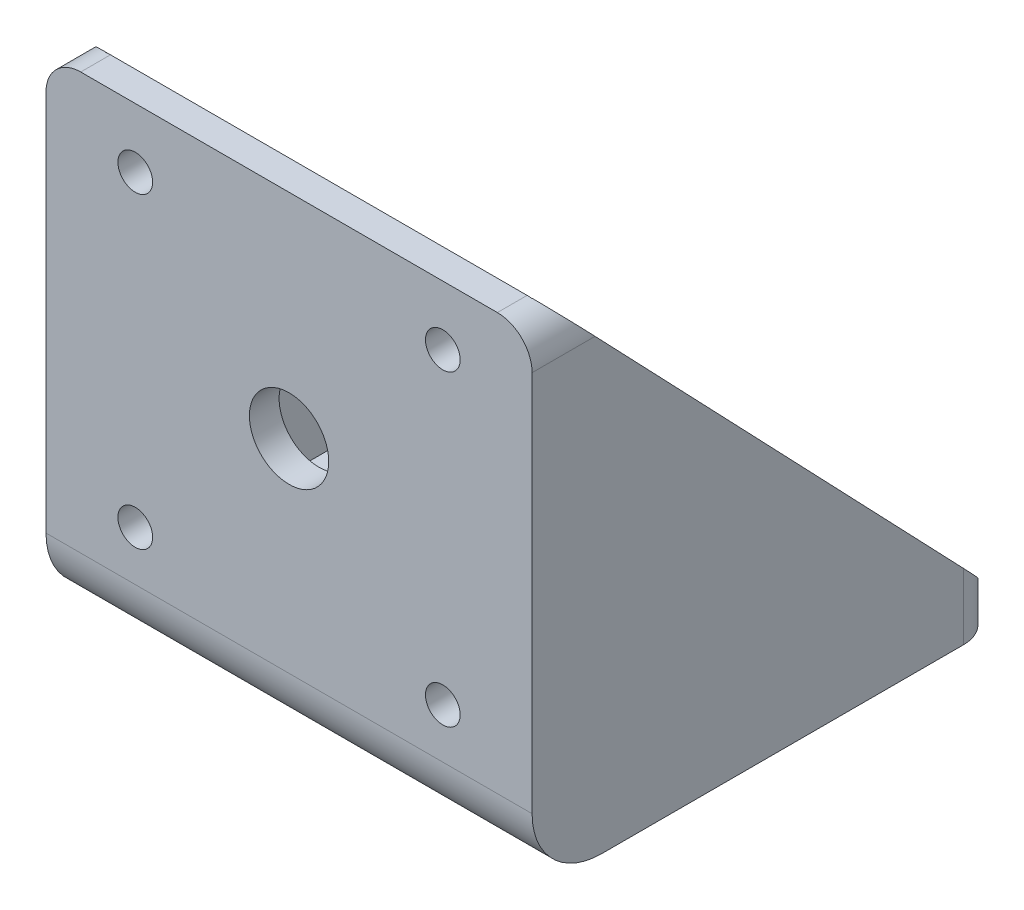
ISO-10303-21;
HEADER;
FILE_DESCRIPTION(('STEP AP214'),'2;1');
FILE_NAME('part.step','',(''),(''),'','','');
FILE_SCHEMA(('AUTOMOTIVE_DESIGN { 1 0 10303 214 1 1 1 1 }'));
ENDSEC;
DATA;
#1=APPLICATION_CONTEXT('core data for automotive mechanical design processes');
#2=APPLICATION_PROTOCOL_DEFINITION('international standard','automotive_design',2000,#1);
#3=PRODUCT_CONTEXT('',#1,'mechanical');
#4=PRODUCT('Part','Part','',(#3));
#5=PRODUCT_RELATED_PRODUCT_CATEGORY('part','',(#4));
#6=PRODUCT_DEFINITION_FORMATION('','',#4);
#7=PRODUCT_DEFINITION_CONTEXT('part definition',#1,'design');
#8=PRODUCT_DEFINITION('design','',#6,#7);
#9=PRODUCT_DEFINITION_SHAPE('','',#8);
#10=(LENGTH_UNIT() NAMED_UNIT(*) SI_UNIT(.MILLI.,.METRE.));
#11=(NAMED_UNIT(*) PLANE_ANGLE_UNIT() SI_UNIT($,.RADIAN.));
#12=(NAMED_UNIT(*) SI_UNIT($,.STERADIAN.) SOLID_ANGLE_UNIT());
#13=UNCERTAINTY_MEASURE_WITH_UNIT(LENGTH_MEASURE(1.E-05),#10,'distance_accuracy_value','');
#14=(GEOMETRIC_REPRESENTATION_CONTEXT(3) GLOBAL_UNCERTAINTY_ASSIGNED_CONTEXT((#13)) GLOBAL_UNIT_ASSIGNED_CONTEXT((#10,
#11,#12)) REPRESENTATION_CONTEXT('',''));
#15=CARTESIAN_POINT('',(0.,0.,0.));
#16=DIRECTION('',(0.,0.,1.));
#17=DIRECTION('',(1.,0.,0.));
#18=AXIS2_PLACEMENT_3D('',#15,#16,#17);
#19=CARTESIAN_POINT('',(0.,3.,0.));
#20=DIRECTION('',(0.,-1.,0.));
#21=DIRECTION('',(0.,0.,-1.));
#22=AXIS2_PLACEMENT_3D('',#19,#20,#21);
#23=PLANE('',#22);
#24=CARTESIAN_POINT('',(-14.945,3.,-12.03));
#25=DIRECTION('',(0.,1.,0.));
#26=DIRECTION('',(0.,0.,-1.));
#27=AXIS2_PLACEMENT_3D('',#24,#25,#26);
#28=CIRCLE('',#27,1.75);
#29=CARTESIAN_POINT('',(-14.945,3.,-13.78));
#30=VERTEX_POINT('',#29);
#31=EDGE_CURVE('E288',#30,#30,#28,.T.);
#32=ORIENTED_EDGE('',*,*,#31,.F.);
#33=EDGE_LOOP('',(#32));
#34=FACE_BOUND('',#33,.T.);
#35=CARTESIAN_POINT('',(-14.945,3.,12.03));
#36=DIRECTION('',(0.,1.,0.));
#37=DIRECTION('',(0.,0.,1.));
#38=AXIS2_PLACEMENT_3D('',#35,#36,#37);
#39=CIRCLE('',#38,1.75);
#40=CARTESIAN_POINT('',(-14.945,3.,13.78));
#41=VERTEX_POINT('',#40);
#42=EDGE_CURVE('E297',#41,#41,#39,.T.);
#43=ORIENTED_EDGE('',*,*,#42,.F.);
#44=EDGE_LOOP('',(#43));
#45=FACE_BOUND('',#44,.T.);
#46=CARTESIAN_POINT('',(14.945,3.,12.03));
#47=DIRECTION('',(0.,1.,0.));
#48=DIRECTION('',(0.,0.,-1.));
#49=AXIS2_PLACEMENT_3D('',#46,#47,#48);
#50=CIRCLE('',#49,1.75);
#51=CARTESIAN_POINT('',(14.945,3.,10.28));
#52=VERTEX_POINT('',#51);
#53=EDGE_CURVE('E396',#52,#52,#50,.T.);
#54=ORIENTED_EDGE('',*,*,#53,.F.);
#55=EDGE_LOOP('',(#54));
#56=FACE_BOUND('',#55,.T.);
#57=CARTESIAN_POINT('',(14.945,3.,-12.03));
#58=DIRECTION('',(0.,1.,0.));
#59=DIRECTION('',(0.,0.,1.));
#60=AXIS2_PLACEMENT_3D('',#57,#58,#59);
#61=CIRCLE('',#60,1.75);
#62=CARTESIAN_POINT('',(14.945,3.,-10.28));
#63=VERTEX_POINT('',#62);
#64=EDGE_CURVE('E304',#63,#63,#61,.T.);
#65=ORIENTED_EDGE('',*,*,#64,.F.);
#66=EDGE_LOOP('',(#65));
#67=FACE_BOUND('',#66,.T.);
#68=DIRECTION('',(0.,0.,1.));
#69=VECTOR('',#68,1.);
#70=CARTESIAN_POINT('',(-21.5,3.,23.5));
#71=LINE('',#70,#69);
#72=CARTESIAN_POINT('',(-21.5,3.,-23.4641016151377));
#73=VERTEX_POINT('',#72);
#74=CARTESIAN_POINT('',(-21.5,3.,15.5));
#75=VERTEX_POINT('',#74);
#76=EDGE_CURVE('E184',#73,#75,#71,.T.);
#77=ORIENTED_EDGE('',*,*,#76,.T.);
#78=DIRECTION('',(-1.,0.,0.));
#79=VECTOR('',#78,1.);
#80=CARTESIAN_POINT('',(21.5,3.,15.5));
#81=LINE('',#80,#79);
#82=CARTESIAN_POINT('',(21.5,3.,15.5));
#83=VERTEX_POINT('',#82);
#84=EDGE_CURVE('E51',#75,#83,#81,.F.);
#85=ORIENTED_EDGE('',*,*,#84,.T.);
#86=DIRECTION('',(0.,0.,-1.));
#87=VECTOR('',#86,1.);
#88=CARTESIAN_POINT('',(21.5,3.,23.5));
#89=LINE('',#88,#87);
#90=CARTESIAN_POINT('',(21.5,3.,-23.4641016151377));
#91=VERTEX_POINT('',#90);
#92=EDGE_CURVE('E271',#83,#91,#89,.T.);
#93=ORIENTED_EDGE('',*,*,#92,.T.);
#94=CARTESIAN_POINT('',(21.,3.,-20.));
#95=DIRECTION('',(0.,-1.,0.));
#96=DIRECTION('',(0.,0.,-1.));
#97=AXIS2_PLACEMENT_3D('',#94,#95,#96);
#98=CIRCLE('',#97,3.5);
#99=CARTESIAN_POINT('',(21.,3.,-23.5));
#100=VERTEX_POINT('',#99);
#101=EDGE_CURVE('E231',#91,#100,#98,.F.);
#102=ORIENTED_EDGE('',*,*,#101,.T.);
#103=DIRECTION('',(-1.,0.,0.));
#104=VECTOR('',#103,1.);
#105=CARTESIAN_POINT('',(-21.5,3.,-23.5));
#106=LINE('',#105,#104);
#107=CARTESIAN_POINT('',(-21.,3.,-23.5));
#108=VERTEX_POINT('',#107);
#109=EDGE_CURVE('E188',#100,#108,#106,.T.);
#110=ORIENTED_EDGE('',*,*,#109,.T.);
#111=CARTESIAN_POINT('',(-21.,3.,-20.));
#112=DIRECTION('',(0.,-1.,0.));
#113=DIRECTION('',(0.,0.,-1.));
#114=AXIS2_PLACEMENT_3D('',#111,#112,#113);
#115=CIRCLE('',#114,3.5);
#116=EDGE_CURVE('E233',#108,#73,#115,.F.);
#117=ORIENTED_EDGE('',*,*,#116,.T.);
#118=EDGE_LOOP('',(#77,#85,#93,#102,#110,#117));
#119=FACE_BOUND('',#118,.T.);
#120=ADVANCED_FACE('F43',(#34,#45,#56,#67,#119),#23,.F.);
#121=CARTESIAN_POINT('',(-21.5,3.,-23.5));
#122=DIRECTION('',(0.,0.,1.));
#123=DIRECTION('',(1.,0.,0.));
#124=AXIS2_PLACEMENT_3D('',#121,#122,#123);
#125=PLANE('',#124);
#126=DIRECTION('',(-1.,0.,0.));
#127=VECTOR('',#126,1.);
#128=CARTESIAN_POINT('',(-21.5,0.,-23.5));
#129=LINE('',#128,#127);
#130=CARTESIAN_POINT('',(21.,0.,-23.5));
#131=VERTEX_POINT('',#130);
#132=CARTESIAN_POINT('',(-21.,0.,-23.5));
#133=VERTEX_POINT('',#132);
#134=EDGE_CURVE('E265',#131,#133,#129,.T.);
#135=ORIENTED_EDGE('',*,*,#134,.T.);
#136=DIRECTION('',(0.,-1.,0.));
#137=VECTOR('',#136,1.);
#138=CARTESIAN_POINT('',(-21.,3.,-23.5));
#139=LINE('',#138,#137);
#140=EDGE_CURVE('E229',#133,#108,#139,.F.);
#141=ORIENTED_EDGE('',*,*,#140,.T.);
#142=ORIENTED_EDGE('',*,*,#109,.F.);
#143=DIRECTION('',(0.,1.,0.));
#144=VECTOR('',#143,1.);
#145=CARTESIAN_POINT('',(21.,3.,-23.5));
#146=LINE('',#145,#144);
#147=EDGE_CURVE('E227',#100,#131,#146,.F.);
#148=ORIENTED_EDGE('',*,*,#147,.T.);
#149=EDGE_LOOP('',(#135,#141,#142,#148));
#150=FACE_BOUND('',#149,.T.);
#151=ADVANCED_FACE('F328',(#150),#125,.F.);
#152=CARTESIAN_POINT('',(-21.5,3.,23.5));
#153=DIRECTION('',(0.,0.,-1.));
#154=DIRECTION('',(-1.,0.,0.));
#155=AXIS2_PLACEMENT_3D('',#152,#153,#154);
#156=PLANE('',#155);
#157=CARTESIAN_POINT('',(0.,27.5,23.5));
#158=DIRECTION('',(0.,0.,1.));
#159=DIRECTION('',(1.,0.,0.));
#160=AXIS2_PLACEMENT_3D('',#157,#158,#159);
#161=CIRCLE('',#160,4.);
#162=CARTESIAN_POINT('',(4.,27.5,23.5));
#163=VERTEX_POINT('',#162);
#164=EDGE_CURVE('E472',#163,#163,#161,.T.);
#165=ORIENTED_EDGE('',*,*,#164,.F.);
#166=EDGE_LOOP('',(#165));
#167=FACE_BOUND('',#166,.T.);
#168=CARTESIAN_POINT('',(15.5,43.,23.5));
#169=DIRECTION('',(0.,0.,1.));
#170=DIRECTION('',(-1.,0.,0.));
#171=AXIS2_PLACEMENT_3D('',#168,#169,#170);
#172=CIRCLE('',#171,1.75);
#173=CARTESIAN_POINT('',(13.75,43.,23.5));
#174=VERTEX_POINT('',#173);
#175=EDGE_CURVE('E382',#174,#174,#172,.T.);
#176=ORIENTED_EDGE('',*,*,#175,.F.);
#177=EDGE_LOOP('',(#176));
#178=FACE_BOUND('',#177,.T.);
#179=CARTESIAN_POINT('',(15.5,12.,23.5));
#180=DIRECTION('',(0.,0.,1.));
#181=DIRECTION('',(-1.,0.,0.));
#182=AXIS2_PLACEMENT_3D('',#179,#180,#181);
#183=CIRCLE('',#182,1.75);
#184=CARTESIAN_POINT('',(13.75,12.,23.5));
#185=VERTEX_POINT('',#184);
#186=EDGE_CURVE('E387',#185,#185,#183,.T.);
#187=ORIENTED_EDGE('',*,*,#186,.F.);
#188=EDGE_LOOP('',(#187));
#189=FACE_BOUND('',#188,.T.);
#190=CARTESIAN_POINT('',(-15.5,12.,23.5));
#191=DIRECTION('',(0.,0.,1.));
#192=DIRECTION('',(1.,0.,0.));
#193=AXIS2_PLACEMENT_3D('',#190,#191,#192);
#194=CIRCLE('',#193,1.75);
#195=CARTESIAN_POINT('',(-13.75,12.,23.5));
#196=VERTEX_POINT('',#195);
#197=EDGE_CURVE('E384',#196,#196,#194,.T.);
#198=ORIENTED_EDGE('',*,*,#197,.F.);
#199=EDGE_LOOP('',(#198));
#200=FACE_BOUND('',#199,.T.);
#201=CARTESIAN_POINT('',(-15.5,43.,23.5));
#202=DIRECTION('',(0.,0.,1.));
#203=DIRECTION('',(1.,0.,0.));
#204=AXIS2_PLACEMENT_3D('',#201,#202,#203);
#205=CIRCLE('',#204,1.75);
#206=CARTESIAN_POINT('',(-13.75,43.,23.5));
#207=VERTEX_POINT('',#206);
#208=EDGE_CURVE('E281',#207,#207,#205,.T.);
#209=ORIENTED_EDGE('',*,*,#208,.F.);
#210=EDGE_LOOP('',(#209));
#211=FACE_BOUND('',#210,.T.);
#212=DIRECTION('',(0.,1.,0.));
#213=VECTOR('',#212,1.);
#214=CARTESIAN_POINT('',(-24.5,49.,23.5));
#215=LINE('',#214,#213);
#216=CARTESIAN_POINT('',(-24.5,7.,23.5));
#217=VERTEX_POINT('',#216);
#218=CARTESIAN_POINT('',(-24.5,45.5,23.5));
#219=VERTEX_POINT('',#218);
#220=EDGE_CURVE('E155',#217,#219,#215,.T.);
#221=ORIENTED_EDGE('',*,*,#220,.F.);
#222=DIRECTION('',(1.,0.,0.));
#223=VECTOR('',#222,1.);
#224=CARTESIAN_POINT('',(24.5,7.,23.5));
#225=LINE('',#224,#223);
#226=CARTESIAN_POINT('',(24.5,7.,23.5));
#227=VERTEX_POINT('',#226);
#228=EDGE_CURVE('E212',#217,#227,#225,.T.);
#229=ORIENTED_EDGE('',*,*,#228,.T.);
#230=DIRECTION('',(0.,-1.,0.));
#231=VECTOR('',#230,1.);
#232=CARTESIAN_POINT('',(24.5,0.,23.5));
#233=LINE('',#232,#231);
#234=CARTESIAN_POINT('',(24.5,45.5,23.5));
#235=VERTEX_POINT('',#234);
#236=EDGE_CURVE('E478',#235,#227,#233,.T.);
#237=ORIENTED_EDGE('',*,*,#236,.F.);
#238=CARTESIAN_POINT('',(21.,45.5,23.5));
#239=DIRECTION('',(0.,0.,-1.));
#240=DIRECTION('',(-1.,0.,0.));
#241=AXIS2_PLACEMENT_3D('',#238,#239,#240);
#242=CIRCLE('',#241,3.5);
#243=CARTESIAN_POINT('',(21.,49.,23.5));
#244=VERTEX_POINT('',#243);
#245=EDGE_CURVE('E179',#235,#244,#242,.F.);
#246=ORIENTED_EDGE('',*,*,#245,.T.);
#247=DIRECTION('',(1.,0.,0.));
#248=VECTOR('',#247,1.);
#249=CARTESIAN_POINT('',(21.5,49.,23.5));
#250=LINE('',#249,#248);
#251=CARTESIAN_POINT('',(-21.,49.,23.5));
#252=VERTEX_POINT('',#251);
#253=EDGE_CURVE('E175',#252,#244,#250,.T.);
#254=ORIENTED_EDGE('',*,*,#253,.F.);
#255=CARTESIAN_POINT('',(-21.,45.5,23.5));
#256=DIRECTION('',(0.,0.,-1.));
#257=DIRECTION('',(-1.,0.,0.));
#258=AXIS2_PLACEMENT_3D('',#255,#256,#257);
#259=CIRCLE('',#258,3.5);
#260=EDGE_CURVE('E172',#252,#219,#259,.F.);
#261=ORIENTED_EDGE('',*,*,#260,.T.);
#262=EDGE_LOOP('',(#221,#229,#237,#246,#254,#261));
#263=FACE_BOUND('',#262,.T.);
#264=ADVANCED_FACE('F173',(#167,#178,#189,#200,#211,#263),#156,.F.);
#265=CARTESIAN_POINT('',(0.,0.,0.));
#266=DIRECTION('',(0.,-1.,0.));
#267=DIRECTION('',(0.,0.,-1.));
#268=AXIS2_PLACEMENT_3D('',#265,#266,#267);
#269=PLANE('',#268);
#270=CARTESIAN_POINT('',(-14.945,0.,-12.03));
#271=DIRECTION('',(0.,1.,0.));
#272=DIRECTION('',(0.,0.,-1.));
#273=AXIS2_PLACEMENT_3D('',#270,#271,#272);
#274=CIRCLE('',#273,1.75);
#275=CARTESIAN_POINT('',(-14.945,0.,-13.78));
#276=VERTEX_POINT('',#275);
#277=EDGE_CURVE('E292',#276,#276,#274,.T.);
#278=ORIENTED_EDGE('',*,*,#277,.T.);
#279=EDGE_LOOP('',(#278));
#280=FACE_BOUND('',#279,.T.);
#281=CARTESIAN_POINT('',(-14.945,0.,12.03));
#282=DIRECTION('',(0.,1.,0.));
#283=DIRECTION('',(0.,0.,1.));
#284=AXIS2_PLACEMENT_3D('',#281,#282,#283);
#285=CIRCLE('',#284,1.75);
#286=CARTESIAN_POINT('',(-14.945,0.,13.78));
#287=VERTEX_POINT('',#286);
#288=EDGE_CURVE('E399',#287,#287,#285,.T.);
#289=ORIENTED_EDGE('',*,*,#288,.T.);
#290=EDGE_LOOP('',(#289));
#291=FACE_BOUND('',#290,.T.);
#292=CARTESIAN_POINT('',(14.945,0.,12.03));
#293=DIRECTION('',(0.,1.,0.));
#294=DIRECTION('',(0.,0.,-1.));
#295=AXIS2_PLACEMENT_3D('',#292,#293,#294);
#296=CIRCLE('',#295,1.75);
#297=CARTESIAN_POINT('',(14.945,0.,10.28));
#298=VERTEX_POINT('',#297);
#299=EDGE_CURVE('E306',#298,#298,#296,.T.);
#300=ORIENTED_EDGE('',*,*,#299,.T.);
#301=EDGE_LOOP('',(#300));
#302=FACE_BOUND('',#301,.T.);
#303=CARTESIAN_POINT('',(14.945,0.,-12.03));
#304=DIRECTION('',(0.,1.,0.));
#305=DIRECTION('',(0.,0.,1.));
#306=AXIS2_PLACEMENT_3D('',#303,#304,#305);
#307=CIRCLE('',#306,1.75);
#308=CARTESIAN_POINT('',(14.945,0.,-10.28));
#309=VERTEX_POINT('',#308);
#310=EDGE_CURVE('E301',#309,#309,#307,.T.);
#311=ORIENTED_EDGE('',*,*,#310,.T.);
#312=EDGE_LOOP('',(#311));
#313=FACE_BOUND('',#312,.T.);
#314=DIRECTION('',(0.,0.,1.));
#315=VECTOR('',#314,1.);
#316=CARTESIAN_POINT('',(-24.5,0.,23.5));
#317=LINE('',#316,#315);
#318=CARTESIAN_POINT('',(-24.5,0.,-20.));
#319=VERTEX_POINT('',#318);
#320=CARTESIAN_POINT('',(-24.5,0.,16.5));
#321=VERTEX_POINT('',#320);
#322=EDGE_CURVE('E168',#319,#321,#317,.T.);
#323=ORIENTED_EDGE('',*,*,#322,.F.);
#324=CARTESIAN_POINT('',(-21.,0.,-20.));
#325=DIRECTION('',(0.,-1.,0.));
#326=DIRECTION('',(0.,0.,-1.));
#327=AXIS2_PLACEMENT_3D('',#324,#325,#326);
#328=CIRCLE('',#327,3.5);
#329=EDGE_CURVE('E225',#319,#133,#328,.T.);
#330=ORIENTED_EDGE('',*,*,#329,.T.);
#331=ORIENTED_EDGE('',*,*,#134,.F.);
#332=CARTESIAN_POINT('',(21.,0.,-20.));
#333=DIRECTION('',(0.,-1.,0.));
#334=DIRECTION('',(0.,0.,-1.));
#335=AXIS2_PLACEMENT_3D('',#332,#333,#334);
#336=CIRCLE('',#335,3.5);
#337=CARTESIAN_POINT('',(24.5,0.,-20.));
#338=VERTEX_POINT('',#337);
#339=EDGE_CURVE('E223',#131,#338,#336,.T.);
#340=ORIENTED_EDGE('',*,*,#339,.T.);
#341=DIRECTION('',(0.,0.,-1.));
#342=VECTOR('',#341,1.);
#343=CARTESIAN_POINT('',(24.5,0.,-23.5));
#344=LINE('',#343,#342);
#345=CARTESIAN_POINT('',(24.5,0.,16.5));
#346=VERTEX_POINT('',#345);
#347=EDGE_CURVE('E369',#346,#338,#344,.T.);
#348=ORIENTED_EDGE('',*,*,#347,.F.);
#349=DIRECTION('',(1.,0.,0.));
#350=VECTOR('',#349,1.);
#351=CARTESIAN_POINT('',(-24.5,0.,16.5));
#352=LINE('',#351,#350);
#353=EDGE_CURVE('E216',#346,#321,#352,.F.);
#354=ORIENTED_EDGE('',*,*,#353,.T.);
#355=EDGE_LOOP('',(#323,#330,#331,#340,#348,#354));
#356=FACE_BOUND('',#355,.T.);
#357=ADVANCED_FACE('F340',(#280,#291,#302,#313,#356),#269,.T.);
#358=CARTESIAN_POINT('',(-21.5,49.,20.5));
#359=DIRECTION('',(0.,0.,1.));
#360=DIRECTION('',(1.,0.,0.));
#361=AXIS2_PLACEMENT_3D('',#358,#359,#360);
#362=PLANE('',#361);
#363=CARTESIAN_POINT('',(0.,27.5,20.5));
#364=DIRECTION('',(0.,0.,1.));
#365=DIRECTION('',(1.,0.,0.));
#366=AXIS2_PLACEMENT_3D('',#363,#364,#365);
#367=CIRCLE('',#366,4.);
#368=CARTESIAN_POINT('',(4.,27.5,20.5));
#369=VERTEX_POINT('',#368);
#370=EDGE_CURVE('E469',#369,#369,#367,.T.);
#371=ORIENTED_EDGE('',*,*,#370,.T.);
#372=EDGE_LOOP('',(#371));
#373=FACE_BOUND('',#372,.T.);
#374=CARTESIAN_POINT('',(15.5,43.,20.5));
#375=DIRECTION('',(0.,0.,1.));
#376=DIRECTION('',(1.,0.,0.));
#377=AXIS2_PLACEMENT_3D('',#374,#375,#376);
#378=CIRCLE('',#377,1.75);
#379=CARTESIAN_POINT('',(17.25,43.,20.5));
#380=VERTEX_POINT('',#379);
#381=EDGE_CURVE('E191',#380,#380,#378,.T.);
#382=ORIENTED_EDGE('',*,*,#381,.T.);
#383=EDGE_LOOP('',(#382));
#384=FACE_BOUND('',#383,.T.);
#385=CARTESIAN_POINT('',(15.5,12.,20.5));
#386=DIRECTION('',(0.,0.,1.));
#387=DIRECTION('',(1.,0.,0.));
#388=AXIS2_PLACEMENT_3D('',#385,#386,#387);
#389=CIRCLE('',#388,1.75);
#390=CARTESIAN_POINT('',(17.25,12.,20.5));
#391=VERTEX_POINT('',#390);
#392=EDGE_CURVE('E283',#391,#391,#389,.T.);
#393=ORIENTED_EDGE('',*,*,#392,.T.);
#394=EDGE_LOOP('',(#393));
#395=FACE_BOUND('',#394,.T.);
#396=CARTESIAN_POINT('',(-15.5,12.,20.5));
#397=DIRECTION('',(0.,0.,1.));
#398=DIRECTION('',(1.,0.,0.));
#399=AXIS2_PLACEMENT_3D('',#396,#397,#398);
#400=CIRCLE('',#399,1.75);
#401=CARTESIAN_POINT('',(-13.75,12.,20.5));
#402=VERTEX_POINT('',#401);
#403=EDGE_CURVE('E280',#402,#402,#400,.T.);
#404=ORIENTED_EDGE('',*,*,#403,.T.);
#405=EDGE_LOOP('',(#404));
#406=FACE_BOUND('',#405,.T.);
#407=CARTESIAN_POINT('',(-15.5,43.,20.5));
#408=DIRECTION('',(0.,0.,1.));
#409=DIRECTION('',(1.,0.,0.));
#410=AXIS2_PLACEMENT_3D('',#407,#408,#409);
#411=CIRCLE('',#410,1.75);
#412=CARTESIAN_POINT('',(-13.75,43.,20.5));
#413=VERTEX_POINT('',#412);
#414=EDGE_CURVE('E277',#413,#413,#411,.T.);
#415=ORIENTED_EDGE('',*,*,#414,.T.);
#416=EDGE_LOOP('',(#415));
#417=FACE_BOUND('',#416,.T.);
#418=DIRECTION('',(0.,-1.,0.));
#419=VECTOR('',#418,1.);
#420=CARTESIAN_POINT('',(21.5,49.,20.5));
#421=LINE('',#420,#419);
#422=CARTESIAN_POINT('',(21.5,48.9641016151378,20.5));
#423=VERTEX_POINT('',#422);
#424=CARTESIAN_POINT('',(21.5,8.,20.5));
#425=VERTEX_POINT('',#424);
#426=EDGE_CURVE('E258',#423,#425,#421,.T.);
#427=ORIENTED_EDGE('',*,*,#426,.T.);
#428=DIRECTION('',(-1.,0.,0.));
#429=VECTOR('',#428,1.);
#430=CARTESIAN_POINT('',(-21.5,8.,20.5));
#431=LINE('',#430,#429);
#432=CARTESIAN_POINT('',(-21.5,8.,20.5));
#433=VERTEX_POINT('',#432);
#434=EDGE_CURVE('E247',#425,#433,#431,.T.);
#435=ORIENTED_EDGE('',*,*,#434,.T.);
#436=DIRECTION('',(0.,-1.,0.));
#437=VECTOR('',#436,1.);
#438=CARTESIAN_POINT('',(-21.5,49.,20.5));
#439=LINE('',#438,#437);
#440=CARTESIAN_POINT('',(-21.5,48.9641016151378,20.5));
#441=VERTEX_POINT('',#440);
#442=EDGE_CURVE('E255',#441,#433,#439,.T.);
#443=ORIENTED_EDGE('',*,*,#442,.F.);
#444=CARTESIAN_POINT('',(-21.,45.5,20.5));
#445=DIRECTION('',(0.,0.,1.));
#446=DIRECTION('',(1.,0.,0.));
#447=AXIS2_PLACEMENT_3D('',#444,#445,#446);
#448=CIRCLE('',#447,3.5);
#449=CARTESIAN_POINT('',(-21.,49.,20.5));
#450=VERTEX_POINT('',#449);
#451=EDGE_CURVE('E197',#441,#450,#448,.F.);
#452=ORIENTED_EDGE('',*,*,#451,.T.);
#453=DIRECTION('',(-1.,0.,0.));
#454=VECTOR('',#453,1.);
#455=CARTESIAN_POINT('',(-21.5,49.,20.5));
#456=LINE('',#455,#454);
#457=CARTESIAN_POINT('',(21.,49.,20.5));
#458=VERTEX_POINT('',#457);
#459=EDGE_CURVE('E263',#458,#450,#456,.T.);
#460=ORIENTED_EDGE('',*,*,#459,.F.);
#461=CARTESIAN_POINT('',(21.,45.5,20.5));
#462=DIRECTION('',(0.,0.,1.));
#463=DIRECTION('',(1.,0.,0.));
#464=AXIS2_PLACEMENT_3D('',#461,#462,#463);
#465=CIRCLE('',#464,3.5);
#466=EDGE_CURVE('E195',#458,#423,#465,.F.);
#467=ORIENTED_EDGE('',*,*,#466,.T.);
#468=EDGE_LOOP('',(#427,#435,#443,#452,#460,#467));
#469=FACE_BOUND('',#468,.T.);
#470=ADVANCED_FACE('F254',(#373,#384,#395,#406,#417,#469),#362,.F.);
#471=CARTESIAN_POINT('',(0.,49.,0.));
#472=DIRECTION('',(0.,-1.,0.));
#473=DIRECTION('',(0.,0.,-1.));
#474=AXIS2_PLACEMENT_3D('',#471,#472,#473);
#475=PLANE('',#474);
#476=ORIENTED_EDGE('',*,*,#459,.T.);
#477=DIRECTION('',(0.,0.,-1.));
#478=VECTOR('',#477,1.);
#479=CARTESIAN_POINT('',(-21.,49.,0.));
#480=LINE('',#479,#478);
#481=EDGE_CURVE('E201',#450,#252,#480,.F.);
#482=ORIENTED_EDGE('',*,*,#481,.T.);
#483=ORIENTED_EDGE('',*,*,#253,.T.);
#484=DIRECTION('',(0.,0.,1.));
#485=VECTOR('',#484,1.);
#486=CARTESIAN_POINT('',(21.,49.,0.));
#487=LINE('',#486,#485);
#488=EDGE_CURVE('E199',#244,#458,#487,.F.);
#489=ORIENTED_EDGE('',*,*,#488,.T.);
#490=EDGE_LOOP('',(#476,#482,#483,#489));
#491=FACE_BOUND('',#490,.T.);
#492=ADVANCED_FACE('F309',(#491),#475,.F.);
#493=CARTESIAN_POINT('',(14.945,0.,-12.03));
#494=DIRECTION('',(0.,1.,0.));
#495=DIRECTION('',(0.,0.,1.));
#496=AXIS2_PLACEMENT_3D('',#493,#494,#495);
#497=CYLINDRICAL_SURFACE('',#496,1.75);
#498=ORIENTED_EDGE('',*,*,#310,.F.);
#499=EDGE_LOOP('',(#498));
#500=FACE_BOUND('',#499,.T.);
#501=ORIENTED_EDGE('',*,*,#64,.T.);
#502=EDGE_LOOP('',(#501));
#503=FACE_BOUND('',#502,.T.);
#504=ADVANCED_FACE('F410',(#500,#503),#497,.F.);
#505=CARTESIAN_POINT('',(14.945,0.,12.03));
#506=DIRECTION('',(0.,1.,0.));
#507=DIRECTION('',(0.,0.,1.));
#508=AXIS2_PLACEMENT_3D('',#505,#506,#507);
#509=CYLINDRICAL_SURFACE('',#508,1.75);
#510=ORIENTED_EDGE('',*,*,#299,.F.);
#511=EDGE_LOOP('',(#510));
#512=FACE_BOUND('',#511,.T.);
#513=ORIENTED_EDGE('',*,*,#53,.T.);
#514=EDGE_LOOP('',(#513));
#515=FACE_BOUND('',#514,.T.);
#516=ADVANCED_FACE('F412',(#512,#515),#509,.F.);
#517=CARTESIAN_POINT('',(-14.945,0.,12.03));
#518=DIRECTION('',(0.,1.,0.));
#519=DIRECTION('',(0.,0.,1.));
#520=AXIS2_PLACEMENT_3D('',#517,#518,#519);
#521=CYLINDRICAL_SURFACE('',#520,1.75);
#522=ORIENTED_EDGE('',*,*,#288,.F.);
#523=EDGE_LOOP('',(#522));
#524=FACE_BOUND('',#523,.T.);
#525=ORIENTED_EDGE('',*,*,#42,.T.);
#526=EDGE_LOOP('',(#525));
#527=FACE_BOUND('',#526,.T.);
#528=ADVANCED_FACE('F404',(#524,#527),#521,.F.);
#529=CARTESIAN_POINT('',(-14.945,0.,-12.03));
#530=DIRECTION('',(0.,1.,0.));
#531=DIRECTION('',(0.,0.,1.));
#532=AXIS2_PLACEMENT_3D('',#529,#530,#531);
#533=CYLINDRICAL_SURFACE('',#532,1.75);
#534=ORIENTED_EDGE('',*,*,#277,.F.);
#535=EDGE_LOOP('',(#534));
#536=FACE_BOUND('',#535,.T.);
#537=ORIENTED_EDGE('',*,*,#31,.T.);
#538=EDGE_LOOP('',(#537));
#539=FACE_BOUND('',#538,.T.);
#540=ADVANCED_FACE('F423',(#536,#539),#533,.F.);
#541=CARTESIAN_POINT('',(-15.5,43.,-23.5));
#542=DIRECTION('',(0.,0.,1.));
#543=DIRECTION('',(1.,0.,0.));
#544=AXIS2_PLACEMENT_3D('',#541,#542,#543);
#545=CYLINDRICAL_SURFACE('',#544,1.75);
#546=ORIENTED_EDGE('',*,*,#208,.T.);
#547=EDGE_LOOP('',(#546));
#548=FACE_BOUND('',#547,.T.);
#549=ORIENTED_EDGE('',*,*,#414,.F.);
#550=EDGE_LOOP('',(#549));
#551=FACE_BOUND('',#550,.T.);
#552=ADVANCED_FACE('F426',(#548,#551),#545,.F.);
#553=CARTESIAN_POINT('',(-15.5,12.,-23.5));
#554=DIRECTION('',(0.,0.,1.));
#555=DIRECTION('',(1.,0.,0.));
#556=AXIS2_PLACEMENT_3D('',#553,#554,#555);
#557=CYLINDRICAL_SURFACE('',#556,1.75);
#558=ORIENTED_EDGE('',*,*,#197,.T.);
#559=EDGE_LOOP('',(#558));
#560=FACE_BOUND('',#559,.T.);
#561=ORIENTED_EDGE('',*,*,#403,.F.);
#562=EDGE_LOOP('',(#561));
#563=FACE_BOUND('',#562,.T.);
#564=ADVANCED_FACE('F433',(#560,#563),#557,.F.);
#565=CARTESIAN_POINT('',(15.5,12.,-23.5));
#566=DIRECTION('',(0.,0.,1.));
#567=DIRECTION('',(1.,0.,0.));
#568=AXIS2_PLACEMENT_3D('',#565,#566,#567);
#569=CYLINDRICAL_SURFACE('',#568,1.75);
#570=ORIENTED_EDGE('',*,*,#186,.T.);
#571=EDGE_LOOP('',(#570));
#572=FACE_BOUND('',#571,.T.);
#573=ORIENTED_EDGE('',*,*,#392,.F.);
#574=EDGE_LOOP('',(#573));
#575=FACE_BOUND('',#574,.T.);
#576=ADVANCED_FACE('F438',(#572,#575),#569,.F.);
#577=CARTESIAN_POINT('',(15.5,43.,-23.5));
#578=DIRECTION('',(0.,0.,1.));
#579=DIRECTION('',(1.,0.,0.));
#580=AXIS2_PLACEMENT_3D('',#577,#578,#579);
#581=CYLINDRICAL_SURFACE('',#580,1.75);
#582=ORIENTED_EDGE('',*,*,#175,.T.);
#583=EDGE_LOOP('',(#582));
#584=FACE_BOUND('',#583,.T.);
#585=ORIENTED_EDGE('',*,*,#381,.F.);
#586=EDGE_LOOP('',(#585));
#587=FACE_BOUND('',#586,.T.);
#588=ADVANCED_FACE('F435',(#584,#587),#581,.F.);
#589=CARTESIAN_POINT('',(-24.5,3.,-23.5));
#590=DIRECTION('',(0.,-0.691222645967364,0.722641857147699));
#591=DIRECTION('',(0.,-0.722641857147699,-0.691222645967364));
#592=AXIS2_PLACEMENT_3D('',#589,#590,#591);
#593=PLANE('',#592);
#594=DIRECTION('',(0.,-0.722641857147699,-0.691222645967364));
#595=VECTOR('',#594,1.);
#596=CARTESIAN_POINT('',(-21.5,3.,-23.5));
#597=LINE('',#596,#595);
#598=CARTESIAN_POINT('',(-21.5,48.9641016151378,20.4656624144796));
#599=VERTEX_POINT('',#598);
#600=CARTESIAN_POINT('',(-21.5,3.03753012962871,-23.4641016151377));
#601=VERTEX_POINT('',#600);
#602=EDGE_CURVE('E366',#599,#601,#597,.T.);
#603=ORIENTED_EDGE('',*,*,#602,.T.);
#604=CARTESIAN_POINT('',(-21.,6.65909090909091,-20.));
#605=DIRECTION('',(0.,-0.691222645967364,0.722641857147699));
#606=DIRECTION('',(0.,-0.722641857147699,-0.691222645967364));
#607=AXIS2_PLACEMENT_3D('',#604,#605,#606);
#608=ELLIPSE('',#607,5.06349151090349,3.5);
#609=CARTESIAN_POINT('',(-24.5,6.65909090909091,-20.));
#610=VERTEX_POINT('',#609);
#611=EDGE_CURVE('E237',#601,#610,#608,.F.);
#612=ORIENTED_EDGE('',*,*,#611,.T.);
#613=DIRECTION('',(0.,-0.722641857147699,-0.691222645967364));
#614=VECTOR('',#613,1.);
#615=CARTESIAN_POINT('',(-24.5,3.,-23.5));
#616=LINE('',#615,#614);
#617=CARTESIAN_POINT('',(-24.5,45.5,17.1521739130435));
#618=VERTEX_POINT('',#617);
#619=EDGE_CURVE('E167',#618,#610,#616,.T.);
#620=ORIENTED_EDGE('',*,*,#619,.F.);
#621=CARTESIAN_POINT('',(-21.,45.5,17.1521739130435));
#622=DIRECTION('',(0.,-0.691222645967364,0.722641857147699));
#623=DIRECTION('',(0.,-0.722641857147699,-0.691222645967364));
#624=AXIS2_PLACEMENT_3D('',#621,#622,#623);
#625=ELLIPSE('',#624,4.8433397060816,3.5);
#626=EDGE_CURVE('E183',#618,#599,#625,.F.);
#627=ORIENTED_EDGE('',*,*,#626,.T.);
#628=EDGE_LOOP('',(#603,#612,#620,#627));
#629=FACE_BOUND('',#628,.T.);
#630=ADVANCED_FACE('F368',(#629),#593,.F.);
#631=CARTESIAN_POINT('',(-24.5,0.,0.));
#632=DIRECTION('',(1.,0.,0.));
#633=DIRECTION('',(0.,0.,-1.));
#634=AXIS2_PLACEMENT_3D('',#631,#632,#633);
#635=PLANE('',#634);
#636=ORIENTED_EDGE('',*,*,#619,.T.);
#637=DIRECTION('',(0.,-1.,0.));
#638=VECTOR('',#637,1.);
#639=CARTESIAN_POINT('',(-24.5,0.,-20.));
#640=LINE('',#639,#638);
#641=EDGE_CURVE('E220',#610,#319,#640,.T.);
#642=ORIENTED_EDGE('',*,*,#641,.T.);
#643=ORIENTED_EDGE('',*,*,#322,.T.);
#644=CARTESIAN_POINT('',(-24.5,7.,16.5));
#645=DIRECTION('',(1.,0.,0.));
#646=DIRECTION('',(0.,0.,-1.));
#647=AXIS2_PLACEMENT_3D('',#644,#645,#646);
#648=CIRCLE('',#647,7.);
#649=EDGE_CURVE('E163',#321,#217,#648,.F.);
#650=ORIENTED_EDGE('',*,*,#649,.T.);
#651=ORIENTED_EDGE('',*,*,#220,.T.);
#652=DIRECTION('',(0.,0.,-1.));
#653=VECTOR('',#652,1.);
#654=CARTESIAN_POINT('',(-24.5,45.5,0.));
#655=LINE('',#654,#653);
#656=EDGE_CURVE('E160',#219,#618,#655,.T.);
#657=ORIENTED_EDGE('',*,*,#656,.T.);
#658=EDGE_LOOP('',(#636,#642,#643,#650,#651,#657));
#659=FACE_BOUND('',#658,.T.);
#660=ADVANCED_FACE('F158',(#659),#635,.F.);
#661=CARTESIAN_POINT('',(-21.5,0.,0.));
#662=DIRECTION('',(1.,0.,0.));
#663=DIRECTION('',(0.,0.,-1.));
#664=AXIS2_PLACEMENT_3D('',#661,#662,#663);
#665=PLANE('',#664);
#666=ORIENTED_EDGE('',*,*,#442,.T.);
#667=CARTESIAN_POINT('',(-21.5,8.,15.5));
#668=DIRECTION('',(1.,0.,0.));
#669=DIRECTION('',(0.,0.,-1.));
#670=AXIS2_PLACEMENT_3D('',#667,#668,#669);
#671=CIRCLE('',#670,5.);
#672=EDGE_CURVE('E65',#433,#75,#671,.T.);
#673=ORIENTED_EDGE('',*,*,#672,.T.);
#674=ORIENTED_EDGE('',*,*,#76,.F.);
#675=DIRECTION('',(0.,-1.,0.));
#676=VECTOR('',#675,1.);
#677=CARTESIAN_POINT('',(-21.5,3.,-23.4641016151377));
#678=LINE('',#677,#676);
#679=EDGE_CURVE('E235',#73,#601,#678,.F.);
#680=ORIENTED_EDGE('',*,*,#679,.T.);
#681=ORIENTED_EDGE('',*,*,#602,.F.);
#682=DIRECTION('',(0.,0.,-1.));
#683=VECTOR('',#682,1.);
#684=CARTESIAN_POINT('',(-21.5,48.9641016151378,20.4656624144796));
#685=LINE('',#684,#683);
#686=EDGE_CURVE('E186',#599,#441,#685,.F.);
#687=ORIENTED_EDGE('',*,*,#686,.T.);
#688=EDGE_LOOP('',(#666,#673,#674,#680,#681,#687));
#689=FACE_BOUND('',#688,.T.);
#690=ADVANCED_FACE('F261',(#689),#665,.T.);
#691=CARTESIAN_POINT('',(21.5,0.,0.));
#692=DIRECTION('',(-1.,0.,0.));
#693=DIRECTION('',(0.,0.,1.));
#694=AXIS2_PLACEMENT_3D('',#691,#692,#693);
#695=PLANE('',#694);
#696=ORIENTED_EDGE('',*,*,#92,.F.);
#697=CARTESIAN_POINT('',(21.5,8.,15.5));
#698=DIRECTION('',(-1.,0.,0.));
#699=DIRECTION('',(0.,0.,1.));
#700=AXIS2_PLACEMENT_3D('',#697,#698,#699);
#701=CIRCLE('',#700,5.);
#702=EDGE_CURVE('E11',#83,#425,#701,.T.);
#703=ORIENTED_EDGE('',*,*,#702,.T.);
#704=ORIENTED_EDGE('',*,*,#426,.F.);
#705=DIRECTION('',(0.,0.,1.));
#706=VECTOR('',#705,1.);
#707=CARTESIAN_POINT('',(21.5,48.9641016151378,20.5));
#708=LINE('',#707,#706);
#709=CARTESIAN_POINT('',(21.5,48.9641016151378,20.4656624144796));
#710=VERTEX_POINT('',#709);
#711=EDGE_CURVE('E206',#423,#710,#708,.F.);
#712=ORIENTED_EDGE('',*,*,#711,.T.);
#713=DIRECTION('',(0.,0.722641857147699,0.691222645967364));
#714=VECTOR('',#713,1.);
#715=CARTESIAN_POINT('',(21.5,49.,20.5));
#716=LINE('',#715,#714);
#717=CARTESIAN_POINT('',(21.5,3.03753012962871,-23.4641016151377));
#718=VERTEX_POINT('',#717);
#719=EDGE_CURVE('E379',#718,#710,#716,.T.);
#720=ORIENTED_EDGE('',*,*,#719,.F.);
#721=DIRECTION('',(0.,1.,0.));
#722=VECTOR('',#721,1.);
#723=CARTESIAN_POINT('',(21.5,3.03753012962873,-23.4641016151377));
#724=LINE('',#723,#722);
#725=EDGE_CURVE('E244',#718,#91,#724,.F.);
#726=ORIENTED_EDGE('',*,*,#725,.T.);
#727=EDGE_LOOP('',(#696,#703,#704,#712,#720,#726));
#728=FACE_BOUND('',#727,.T.);
#729=ADVANCED_FACE('F318',(#728),#695,.T.);
#730=CARTESIAN_POINT('',(24.5,49.,20.5));
#731=DIRECTION('',(0.,-0.691222645967364,0.722641857147699));
#732=DIRECTION('',(0.,-0.722641857147699,-0.691222645967364));
#733=AXIS2_PLACEMENT_3D('',#730,#731,#732);
#734=PLANE('',#733);
#735=DIRECTION('',(0.,0.722641857147699,0.691222645967364));
#736=VECTOR('',#735,1.);
#737=CARTESIAN_POINT('',(24.5,49.,20.5));
#738=LINE('',#737,#736);
#739=CARTESIAN_POINT('',(24.5,6.65909090909091,-20.));
#740=VERTEX_POINT('',#739);
#741=CARTESIAN_POINT('',(24.5,45.5,17.1521739130435));
#742=VERTEX_POINT('',#741);
#743=EDGE_CURVE('E476',#740,#742,#738,.T.);
#744=ORIENTED_EDGE('',*,*,#743,.F.);
#745=CARTESIAN_POINT('',(21.,6.65909090909092,-20.));
#746=DIRECTION('',(0.,-0.691222645967364,0.722641857147699));
#747=DIRECTION('',(0.,0.722641857147699,0.691222645967364));
#748=AXIS2_PLACEMENT_3D('',#745,#746,#747);
#749=ELLIPSE('',#748,5.06349151090349,3.5);
#750=EDGE_CURVE('E242',#740,#718,#749,.F.);
#751=ORIENTED_EDGE('',*,*,#750,.T.);
#752=ORIENTED_EDGE('',*,*,#719,.T.);
#753=CARTESIAN_POINT('',(21.,45.5,17.1521739130435));
#754=DIRECTION('',(0.,-0.691222645967364,0.722641857147699));
#755=DIRECTION('',(0.,0.722641857147699,0.691222645967364));
#756=AXIS2_PLACEMENT_3D('',#753,#754,#755);
#757=ELLIPSE('',#756,4.8433397060816,3.5);
#758=EDGE_CURVE('E209',#710,#742,#757,.F.);
#759=ORIENTED_EDGE('',*,*,#758,.T.);
#760=EDGE_LOOP('',(#744,#751,#752,#759));
#761=FACE_BOUND('',#760,.T.);
#762=ADVANCED_FACE('F452',(#761),#734,.F.);
#763=CARTESIAN_POINT('',(24.5,0.,0.));
#764=DIRECTION('',(-1.,0.,0.));
#765=DIRECTION('',(0.,0.,1.));
#766=AXIS2_PLACEMENT_3D('',#763,#764,#765);
#767=PLANE('',#766);
#768=ORIENTED_EDGE('',*,*,#347,.T.);
#769=DIRECTION('',(0.,1.,0.));
#770=VECTOR('',#769,1.);
#771=CARTESIAN_POINT('',(24.5,0.,-20.));
#772=LINE('',#771,#770);
#773=EDGE_CURVE('E239',#338,#740,#772,.T.);
#774=ORIENTED_EDGE('',*,*,#773,.T.);
#775=ORIENTED_EDGE('',*,*,#743,.T.);
#776=DIRECTION('',(0.,0.,1.));
#777=VECTOR('',#776,1.);
#778=CARTESIAN_POINT('',(24.5,45.5,0.));
#779=LINE('',#778,#777);
#780=EDGE_CURVE('E178',#742,#235,#779,.T.);
#781=ORIENTED_EDGE('',*,*,#780,.T.);
#782=ORIENTED_EDGE('',*,*,#236,.T.);
#783=CARTESIAN_POINT('',(24.5,7.,16.5));
#784=DIRECTION('',(-1.,0.,0.));
#785=DIRECTION('',(0.,0.,1.));
#786=AXIS2_PLACEMENT_3D('',#783,#784,#785);
#787=CIRCLE('',#786,7.);
#788=EDGE_CURVE('E214',#227,#346,#787,.F.);
#789=ORIENTED_EDGE('',*,*,#788,.T.);
#790=EDGE_LOOP('',(#768,#774,#775,#781,#782,#789));
#791=FACE_BOUND('',#790,.T.);
#792=ADVANCED_FACE('F455',(#791),#767,.F.);
#793=CARTESIAN_POINT('',(0.,27.5,20.5));
#794=DIRECTION('',(0.,0.,1.));
#795=DIRECTION('',(1.,0.,0.));
#796=AXIS2_PLACEMENT_3D('',#793,#794,#795);
#797=CYLINDRICAL_SURFACE('',#796,4.);
#798=ORIENTED_EDGE('',*,*,#370,.F.);
#799=EDGE_LOOP('',(#798));
#800=FACE_BOUND('',#799,.T.);
#801=ORIENTED_EDGE('',*,*,#164,.T.);
#802=EDGE_LOOP('',(#801));
#803=FACE_BOUND('',#802,.T.);
#804=ADVANCED_FACE('F349',(#800,#803),#797,.F.);
#805=CARTESIAN_POINT('',(-21.,45.5,0.));
#806=DIRECTION('',(0.,0.,-1.));
#807=DIRECTION('',(-1.,0.,0.));
#808=AXIS2_PLACEMENT_3D('',#805,#806,#807);
#809=CYLINDRICAL_SURFACE('',#808,3.5);
#810=ORIENTED_EDGE('',*,*,#260,.F.);
#811=ORIENTED_EDGE('',*,*,#481,.F.);
#812=ORIENTED_EDGE('',*,*,#451,.F.);
#813=ORIENTED_EDGE('',*,*,#686,.F.);
#814=ORIENTED_EDGE('',*,*,#626,.F.);
#815=ORIENTED_EDGE('',*,*,#656,.F.);
#816=EDGE_LOOP('',(#810,#811,#812,#813,#814,#815));
#817=FACE_BOUND('',#816,.T.);
#818=ADVANCED_FACE('F181',(#817),#809,.T.);
#819=CARTESIAN_POINT('',(21.,45.5,0.));
#820=DIRECTION('',(0.,0.,1.));
#821=DIRECTION('',(1.,0.,0.));
#822=AXIS2_PLACEMENT_3D('',#819,#820,#821);
#823=CYLINDRICAL_SURFACE('',#822,3.5);
#824=ORIENTED_EDGE('',*,*,#466,.F.);
#825=ORIENTED_EDGE('',*,*,#488,.F.);
#826=ORIENTED_EDGE('',*,*,#245,.F.);
#827=ORIENTED_EDGE('',*,*,#780,.F.);
#828=ORIENTED_EDGE('',*,*,#758,.F.);
#829=ORIENTED_EDGE('',*,*,#711,.F.);
#830=EDGE_LOOP('',(#824,#825,#826,#827,#828,#829));
#831=FACE_BOUND('',#830,.T.);
#832=ADVANCED_FACE('F313',(#831),#823,.T.);
#833=CARTESIAN_POINT('',(-21.5,7.,16.5));
#834=DIRECTION('',(-1.,0.,0.));
#835=DIRECTION('',(0.,0.,1.));
#836=AXIS2_PLACEMENT_3D('',#833,#834,#835);
#837=CYLINDRICAL_SURFACE('',#836,7.);
#838=ORIENTED_EDGE('',*,*,#649,.F.);
#839=ORIENTED_EDGE('',*,*,#353,.F.);
#840=ORIENTED_EDGE('',*,*,#788,.F.);
#841=ORIENTED_EDGE('',*,*,#228,.F.);
#842=EDGE_LOOP('',(#838,#839,#840,#841));
#843=FACE_BOUND('',#842,.T.);
#844=ADVANCED_FACE('F352',(#843),#837,.T.);
#845=CARTESIAN_POINT('',(-21.,0.,-20.));
#846=DIRECTION('',(0.,-1.,0.));
#847=DIRECTION('',(0.,0.,-1.));
#848=AXIS2_PLACEMENT_3D('',#845,#846,#847);
#849=CYLINDRICAL_SURFACE('',#848,3.5);
#850=ORIENTED_EDGE('',*,*,#116,.F.);
#851=ORIENTED_EDGE('',*,*,#140,.F.);
#852=ORIENTED_EDGE('',*,*,#329,.F.);
#853=ORIENTED_EDGE('',*,*,#641,.F.);
#854=ORIENTED_EDGE('',*,*,#611,.F.);
#855=ORIENTED_EDGE('',*,*,#679,.F.);
#856=EDGE_LOOP('',(#850,#851,#852,#853,#854,#855));
#857=FACE_BOUND('',#856,.T.);
#858=ADVANCED_FACE('F325',(#857),#849,.T.);
#859=CARTESIAN_POINT('',(21.,0.,-20.));
#860=DIRECTION('',(0.,1.,0.));
#861=DIRECTION('',(0.,0.,1.));
#862=AXIS2_PLACEMENT_3D('',#859,#860,#861);
#863=CYLINDRICAL_SURFACE('',#862,3.5);
#864=ORIENTED_EDGE('',*,*,#339,.F.);
#865=ORIENTED_EDGE('',*,*,#147,.F.);
#866=ORIENTED_EDGE('',*,*,#101,.F.);
#867=ORIENTED_EDGE('',*,*,#725,.F.);
#868=ORIENTED_EDGE('',*,*,#750,.F.);
#869=ORIENTED_EDGE('',*,*,#773,.F.);
#870=EDGE_LOOP('',(#864,#865,#866,#867,#868,#869));
#871=FACE_BOUND('',#870,.T.);
#872=ADVANCED_FACE('F321',(#871),#863,.T.);
#873=CARTESIAN_POINT('',(-21.5,8.,15.5));
#874=DIRECTION('',(1.,0.,0.));
#875=DIRECTION('',(0.,0.,-1.));
#876=AXIS2_PLACEMENT_3D('',#873,#874,#875);
#877=CYLINDRICAL_SURFACE('',#876,5.);
#878=ORIENTED_EDGE('',*,*,#702,.F.);
#879=ORIENTED_EDGE('',*,*,#84,.F.);
#880=ORIENTED_EDGE('',*,*,#672,.F.);
#881=ORIENTED_EDGE('',*,*,#434,.F.);
#882=EDGE_LOOP('',(#878,#879,#880,#881));
#883=FACE_BOUND('',#882,.T.);
#884=ADVANCED_FACE('F45',(#883),#877,.F.);
#885=CLOSED_SHELL('',(#120,#151,#264,#357,#470,#492,#504,#516,#528,#540,#552,#564,#576,#588,
#630,#660,#690,#729,#762,#792,#804,#818,#832,#844,#858,#872,#884));
#886=MANIFOLD_SOLID_BREP('B2',#885);
#887=ADVANCED_BREP_SHAPE_REPRESENTATION('',(#18,#886),#14);
#888=SHAPE_DEFINITION_REPRESENTATION(#9,#887);
ENDSEC;
END-ISO-10303-21;
